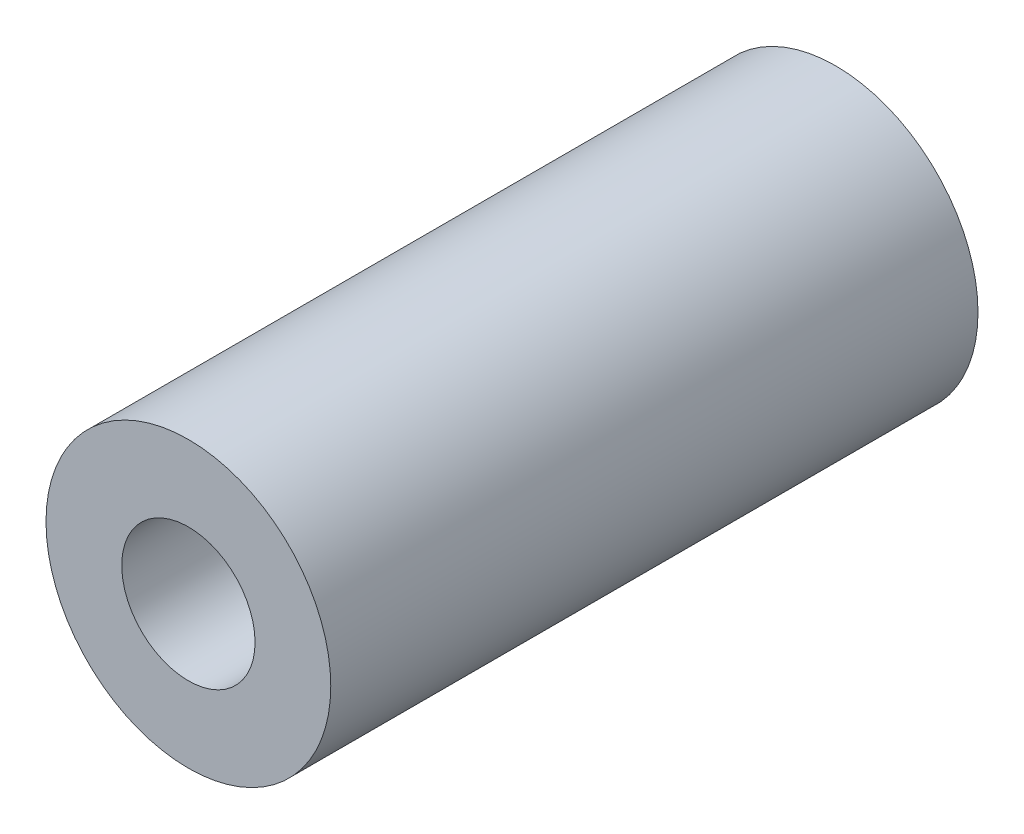
ISO-10303-21;
HEADER;
FILE_DESCRIPTION(('STEP AP214'),'2;1');
FILE_NAME('part.step','',(''),(''),'','','');
FILE_SCHEMA(('AUTOMOTIVE_DESIGN { 1 0 10303 214 1 1 1 1 }'));
ENDSEC;
DATA;
#1=APPLICATION_CONTEXT('core data for automotive mechanical design processes');
#2=APPLICATION_PROTOCOL_DEFINITION('international standard','automotive_design',2000,#1);
#3=PRODUCT_CONTEXT('',#1,'mechanical');
#4=PRODUCT('Part','Part','',(#3));
#5=PRODUCT_RELATED_PRODUCT_CATEGORY('part','',(#4));
#6=PRODUCT_DEFINITION_FORMATION('','',#4);
#7=PRODUCT_DEFINITION_CONTEXT('part definition',#1,'design');
#8=PRODUCT_DEFINITION('design','',#6,#7);
#9=PRODUCT_DEFINITION_SHAPE('','',#8);
#10=(LENGTH_UNIT() NAMED_UNIT(*) SI_UNIT(.MILLI.,.METRE.));
#11=(NAMED_UNIT(*) PLANE_ANGLE_UNIT() SI_UNIT($,.RADIAN.));
#12=(NAMED_UNIT(*) SI_UNIT($,.STERADIAN.) SOLID_ANGLE_UNIT());
#13=UNCERTAINTY_MEASURE_WITH_UNIT(LENGTH_MEASURE(1.E-05),#10,'distance_accuracy_value','');
#14=(GEOMETRIC_REPRESENTATION_CONTEXT(3) GLOBAL_UNCERTAINTY_ASSIGNED_CONTEXT((#13)) GLOBAL_UNIT_ASSIGNED_CONTEXT((#10,
#11,#12)) REPRESENTATION_CONTEXT('',''));
#15=CARTESIAN_POINT('',(0.,0.,0.));
#16=DIRECTION('',(0.,0.,1.));
#17=DIRECTION('',(1.,0.,0.));
#18=AXIS2_PLACEMENT_3D('',#15,#16,#17);
#19=CARTESIAN_POINT('',(10.,0.,2.));
#20=DIRECTION('',(0.,0.,1.));
#21=DIRECTION('',(1.,0.,0.));
#22=AXIS2_PLACEMENT_3D('',#19,#20,#21);
#23=CYLINDRICAL_SURFACE('',#22,5.5);
#24=CARTESIAN_POINT('',(10.,0.,13.));
#25=DIRECTION('',(0.,0.,1.));
#26=DIRECTION('',(1.,0.,0.));
#27=AXIS2_PLACEMENT_3D('',#24,#25,#26);
#28=CIRCLE('',#27,5.5);
#29=CARTESIAN_POINT('',(15.5,0.,13.));
#30=VERTEX_POINT('',#29);
#31=EDGE_CURVE('E116',#30,#30,#28,.T.);
#32=ORIENTED_EDGE('',*,*,#31,.F.);
#33=EDGE_LOOP('',(#32));
#34=FACE_BOUND('',#33,.T.);
#35=CARTESIAN_POINT('',(10.,0.,-12.));
#36=DIRECTION('',(0.,0.,-1.));
#37=DIRECTION('',(-1.,0.,0.));
#38=AXIS2_PLACEMENT_3D('',#35,#36,#37);
#39=CIRCLE('',#38,5.5);
#40=CARTESIAN_POINT('',(4.5,0.,-12.));
#41=VERTEX_POINT('',#40);
#42=EDGE_CURVE('E213',#41,#41,#39,.T.);
#43=ORIENTED_EDGE('',*,*,#42,.F.);
#44=EDGE_LOOP('',(#43));
#45=FACE_BOUND('',#44,.T.);
#46=ADVANCED_FACE('F57',(#34,#45),#23,.T.);
#47=CARTESIAN_POINT('',(10.,0.,13.));
#48=DIRECTION('',(0.,0.,1.));
#49=DIRECTION('',(1.,0.,0.));
#50=AXIS2_PLACEMENT_3D('',#47,#48,#49);
#51=PLANE('',#50);
#52=ORIENTED_EDGE('',*,*,#31,.T.);
#53=EDGE_LOOP('',(#52));
#54=FACE_BOUND('',#53,.T.);
#55=CARTESIAN_POINT('',(10.,0.,13.));
#56=DIRECTION('',(0.,0.,1.));
#57=DIRECTION('',(1.,0.,0.));
#58=AXIS2_PLACEMENT_3D('',#55,#56,#57);
#59=CIRCLE('',#58,2.575);
#60=CARTESIAN_POINT('',(12.575,0.,13.));
#61=VERTEX_POINT('',#60);
#62=EDGE_CURVE('E205',#61,#61,#59,.T.);
#63=ORIENTED_EDGE('',*,*,#62,.F.);
#64=EDGE_LOOP('',(#63));
#65=FACE_BOUND('',#64,.T.);
#66=ADVANCED_FACE('F151',(#54,#65),#51,.T.);
#67=CARTESIAN_POINT('',(10.,0.,3.2));
#68=DIRECTION('',(0.,0.,1.));
#69=DIRECTION('',(1.,0.,0.));
#70=AXIS2_PLACEMENT_3D('',#67,#68,#69);
#71=CYLINDRICAL_SURFACE('',#70,2.575);
#72=CARTESIAN_POINT('',(10.,0.,7.2));
#73=DIRECTION('',(0.,0.,1.));
#74=DIRECTION('',(1.,0.,0.));
#75=AXIS2_PLACEMENT_3D('',#72,#73,#74);
#76=CIRCLE('',#75,2.575);
#77=CARTESIAN_POINT('',(12.575,0.,7.2));
#78=VERTEX_POINT('',#77);
#79=EDGE_CURVE('E209',#78,#78,#76,.T.);
#80=ORIENTED_EDGE('',*,*,#79,.F.);
#81=EDGE_LOOP('',(#80));
#82=FACE_BOUND('',#81,.T.);
#83=ORIENTED_EDGE('',*,*,#62,.T.);
#84=EDGE_LOOP('',(#83));
#85=FACE_BOUND('',#84,.T.);
#86=ADVANCED_FACE('F234',(#82,#85),#71,.F.);
#87=CARTESIAN_POINT('',(10.,0.,7.2));
#88=DIRECTION('',(0.,0.,1.));
#89=DIRECTION('',(1.,0.,0.));
#90=AXIS2_PLACEMENT_3D('',#87,#88,#89);
#91=PLANE('',#90);
#92=ORIENTED_EDGE('',*,*,#79,.T.);
#93=EDGE_LOOP('',(#92));
#94=FACE_BOUND('',#93,.T.);
#95=ADVANCED_FACE('F229',(#94),#91,.T.);
#96=CARTESIAN_POINT('',(10.,0.,-12.));
#97=DIRECTION('',(0.,0.,1.));
#98=DIRECTION('',(1.,0.,0.));
#99=AXIS2_PLACEMENT_3D('',#96,#97,#98);
#100=CYLINDRICAL_SURFACE('',#99,4.5);
#101=CARTESIAN_POINT('',(10.,0.,-12.));
#102=DIRECTION('',(0.,0.,-1.));
#103=DIRECTION('',(-1.,0.,0.));
#104=AXIS2_PLACEMENT_3D('',#101,#102,#103);
#105=CIRCLE('',#104,4.5);
#106=CARTESIAN_POINT('',(5.5,0.,-12.));
#107=VERTEX_POINT('',#106);
#108=EDGE_CURVE('E217',#107,#107,#105,.T.);
#109=ORIENTED_EDGE('',*,*,#108,.T.);
#110=EDGE_LOOP('',(#109));
#111=FACE_BOUND('',#110,.T.);
#112=CARTESIAN_POINT('',(11.,4.38748219369606,0.999999999999999));
#113=CARTESIAN_POINT('',(11.0000002271548,4.3874805778013,1.02776343673585));
#114=CARTESIAN_POINT('',(10.9988430525421,4.38774605427742,1.05551321957021));
#115=CARTESIAN_POINT('',(10.994229328652,4.38879440795356,1.11080720358759));
#116=CARTESIAN_POINT('',(10.9907731063926,4.3895772115685,1.13835143344523));
#117=CARTESIAN_POINT('',(10.9770029556911,4.39267106819928,1.22027488575532));
#118=CARTESIAN_POINT('',(10.9632873499948,4.39572774349608,1.27409430984986));
#119=CARTESIAN_POINT('',(10.9272147151132,4.40347687632207,1.37859393292456));
#120=CARTESIAN_POINT('',(10.9048573167925,4.40816940372606,1.42927399769925));
#121=CARTESIAN_POINT('',(10.8521566293915,4.41865913159282,1.52618505036688));
#122=CARTESIAN_POINT('',(10.8218117381529,4.42445655361464,1.57241514312584));
#123=CARTESIAN_POINT('',(10.7534424909377,4.43661416599544,1.65988955298778));
#124=CARTESIAN_POINT('',(10.7153064065994,4.4429816856951,1.70104549615343));
#125=CARTESIAN_POINT('',(10.6326713535901,4.4554988564669,1.77643748444432));
#126=CARTESIAN_POINT('',(10.5881711857622,4.4616484662061,1.81067222249565));
#127=CARTESIAN_POINT('',(10.4934687158107,4.47311819819122,1.87160466427186));
#128=CARTESIAN_POINT('',(10.4432084719777,4.4784283286008,1.89821425841024));
#129=CARTESIAN_POINT('',(10.3388041930967,4.48753264692153,1.94256171890918));
#130=CARTESIAN_POINT('',(10.2846630293892,4.49132794221922,1.96030606840746));
#131=CARTESIAN_POINT('',(10.1918524490983,4.49606579682076,1.98218264843362));
#132=CARTESIAN_POINT('',(10.1537892434148,4.49753288084804,1.98885526694093));
#133=CARTESIAN_POINT('',(10.077157061699,4.49950350767662,1.9977659348373));
#134=CARTESIAN_POINT('',(10.0385885578001,4.50000789319572,2.00000786278274));
#135=CARTESIAN_POINT('',(10.,4.5,2.));
#136=B_SPLINE_CURVE_WITH_KNOTS('',3,(#112,#113,#114,#115,#116,#117,#118,#119,#120,#121,#122,
#123,#124,#125,#126,#127,#128,#129,#130,#131,#132,#133,#134,#135),.UNSPECIFIED.,.F.,.F.,(4,2,2,
2,2,2,2,2,2,2,2,4),(0.,0.083238019862018,0.166464202423338,0.332474072063291,0.498491033620594,
0.664541320830127,0.833165067614467,1.00182062941272,1.17235295167543,1.34276038073884,
1.45852112762865,1.57418049442813),.UNSPECIFIED.);
#137=CARTESIAN_POINT('',(11.,4.38748219369606,0.999999999999999));
#138=VERTEX_POINT('',#137);
#139=CARTESIAN_POINT('',(10.,4.5,2.));
#140=VERTEX_POINT('',#139);
#141=EDGE_CURVE('E68',#138,#140,#136,.T.);
#142=ORIENTED_EDGE('',*,*,#141,.T.);
#143=CARTESIAN_POINT('',(10.,4.5,2.));
#144=CARTESIAN_POINT('',(9.97222798279285,4.50000141835623,2.00000020406704));
#145=CARTESIAN_POINT('',(9.94446959113142,4.49974258775545,1.99884233571868));
#146=CARTESIAN_POINT('',(9.88915790277006,4.49871951361042,1.99422569850821));
#147=CARTESIAN_POINT('',(9.86160457903483,4.49795533792657,1.99076723858132));
#148=CARTESIAN_POINT('',(9.77965062015803,4.49493257916072,1.97698739496016));
#149=CARTESIAN_POINT('',(9.72580915099412,4.49194360792207,1.96326135975001));
#150=CARTESIAN_POINT('',(9.62126419304536,4.48434107914671,1.92715837743288));
#151=CARTESIAN_POINT('',(9.5705609499438,4.47972739460423,1.90478075400754));
#152=CARTESIAN_POINT('',(9.47361155064011,4.46937277287342,1.85203277940782));
#153=CARTESIAN_POINT('',(9.42736618765927,4.46363163561964,1.82166100935342));
#154=CARTESIAN_POINT('',(9.3399087420806,4.45154583986649,1.75326425101779));
#155=CARTESIAN_POINT('',(9.2987803858627,4.44519356763016,1.71513359430603));
#156=CARTESIAN_POINT('',(9.22344169050527,4.43265371720239,1.63252081553737));
#157=CARTESIAN_POINT('',(9.18923279444397,4.42646617359886,1.58803737187733));
#158=CARTESIAN_POINT('',(9.12832827664668,4.41487984737743,1.49335048303818));
#159=CARTESIAN_POINT('',(9.10172527982592,4.40949114440257,1.44308618249789));
#160=CARTESIAN_POINT('',(9.05739143314611,4.40022784762102,1.33867383869463));
#161=CARTESIAN_POINT('',(9.0396539041132,4.39635211443829,1.28452875445653));
#162=CARTESIAN_POINT('',(9.01779580237956,4.39150973400137,1.19173679596455));
#163=CARTESIAN_POINT('',(9.01113147078784,4.39000855246454,1.15369769761514));
#164=CARTESIAN_POINT('',(9.00223147373591,4.38799083437755,1.07711219186973));
#165=CARTESIAN_POINT('',(8.99999209210795,4.38747347160907,1.03856623755596));
#166=CARTESIAN_POINT('',(9.,4.38748219369606,0.999999999999999));
#167=B_SPLINE_CURVE_WITH_KNOTS('',3,(#143,#144,#145,#146,#147,#148,#149,#150,#151,#152,#153,
#154,#155,#156,#157,#158,#159,#160,#161,#162,#163,#164,#165,#166),.UNSPECIFIED.,.F.,.F.,(4,2,2,
2,2,2,2,2,2,2,2,4),(0.,0.0832638399317092,0.166516501024766,0.332586996091267,0.498670475969319,
0.664783453883492,0.833331638683261,1.0019149386503,1.17247140841256,1.34289918784782,
1.45858836675132,1.57418034604105),.UNSPECIFIED.);
#168=CARTESIAN_POINT('',(9.,4.38748219369606,0.999999999999999));
#169=VERTEX_POINT('',#168);
#170=EDGE_CURVE('E112',#140,#169,#167,.T.);
#171=ORIENTED_EDGE('',*,*,#170,.T.);
#172=DIRECTION('',(0.,0.,1.));
#173=VECTOR('',#172,1.);
#174=CARTESIAN_POINT('',(9.,4.38748219369606,-10.));
#175=LINE('',#174,#173);
#176=CARTESIAN_POINT('',(9.,4.38748219369606,-10.));
#177=VERTEX_POINT('',#176);
#178=EDGE_CURVE('E190',#177,#169,#175,.T.);
#179=ORIENTED_EDGE('',*,*,#178,.F.);
#180=CARTESIAN_POINT('',(10.,0.,-10.));
#181=DIRECTION('',(0.,0.,-1.));
#182=DIRECTION('',(-1.,0.,0.));
#183=AXIS2_PLACEMENT_3D('',#180,#181,#182);
#184=CIRCLE('',#183,4.5);
#185=CARTESIAN_POINT('',(9.,-4.38748219369606,-10.));
#186=VERTEX_POINT('',#185);
#187=EDGE_CURVE('E188',#186,#177,#184,.T.);
#188=ORIENTED_EDGE('',*,*,#187,.F.);
#189=DIRECTION('',(0.,0.,1.));
#190=VECTOR('',#189,1.);
#191=CARTESIAN_POINT('',(9.,-4.38748219369606,-10.));
#192=LINE('',#191,#190);
#193=CARTESIAN_POINT('',(9.,-4.38748219369606,0.999999999999999));
#194=VERTEX_POINT('',#193);
#195=EDGE_CURVE('E122',#186,#194,#192,.T.);
#196=ORIENTED_EDGE('',*,*,#195,.T.);
#197=CARTESIAN_POINT('',(9.,-4.38748219369606,0.999999999999999));
#198=CARTESIAN_POINT('',(8.99999977284519,-4.3874805778013,1.02776343673585));
#199=CARTESIAN_POINT('',(9.0011569474579,-4.38774605427743,1.05551321957021));
#200=CARTESIAN_POINT('',(9.00577067134805,-4.38879440795356,1.11080720358759));
#201=CARTESIAN_POINT('',(9.00922689360742,-4.3895772115685,1.13835143344523));
#202=CARTESIAN_POINT('',(9.02299704430893,-4.39267106819928,1.22027488575532));
#203=CARTESIAN_POINT('',(9.03671265000516,-4.39572774349608,1.27409430984986));
#204=CARTESIAN_POINT('',(9.0727852848868,-4.40347687632207,1.37859393292456));
#205=CARTESIAN_POINT('',(9.09514268320753,-4.40816940372606,1.42927399769925));
#206=CARTESIAN_POINT('',(9.14784337060851,-4.41865913159283,1.52618505036688));
#207=CARTESIAN_POINT('',(9.17818826184709,-4.42445655361464,1.57241514312584));
#208=CARTESIAN_POINT('',(9.24655750906227,-4.43661416599544,1.65988955298778));
#209=CARTESIAN_POINT('',(9.28469359340062,-4.4429816856951,1.70104549615343));
#210=CARTESIAN_POINT('',(9.36732864640992,-4.4554988564669,1.77643748444432));
#211=CARTESIAN_POINT('',(9.41182881423781,-4.4616484662061,1.81067222249565));
#212=CARTESIAN_POINT('',(9.50653128418931,-4.47311819819122,1.87160466427186));
#213=CARTESIAN_POINT('',(9.55679152802235,-4.4784283286008,1.89821425841024));
#214=CARTESIAN_POINT('',(9.66119580690326,-4.48753264692153,1.94256171890918));
#215=CARTESIAN_POINT('',(9.71533697061081,-4.49132794221922,1.96030606840746));
#216=CARTESIAN_POINT('',(9.80814755090169,-4.49606579682076,1.98218264843362));
#217=CARTESIAN_POINT('',(9.84621075658522,-4.49753288084804,1.98885526694093));
#218=CARTESIAN_POINT('',(9.92284293830104,-4.49950350767662,1.9977659348373));
#219=CARTESIAN_POINT('',(9.96141144219989,-4.50000789319572,2.00000786278274));
#220=CARTESIAN_POINT('',(10.,-4.5,2.));
#221=B_SPLINE_CURVE_WITH_KNOTS('',3,(#197,#198,#199,#200,#201,#202,#203,#204,#205,#206,#207,
#208,#209,#210,#211,#212,#213,#214,#215,#216,#217,#218,#219,#220),.UNSPECIFIED.,.F.,.F.,(4,2,2,
2,2,2,2,2,2,2,2,4),(0.,0.083238019862018,0.166464202423338,0.332474072063291,0.498491033620593,
0.664541320830127,0.833165067614467,1.00182062941272,1.17235295167542,1.34276038073884,
1.45852112762865,1.57418049442813),.UNSPECIFIED.);
#222=CARTESIAN_POINT('',(10.,-4.5,2.));
#223=VERTEX_POINT('',#222);
#224=EDGE_CURVE('E109',#194,#223,#221,.T.);
#225=ORIENTED_EDGE('',*,*,#224,.T.);
#226=CARTESIAN_POINT('',(10.,-4.5,2.));
#227=CARTESIAN_POINT('',(10.0277720172072,-4.50000141835623,2.00000020406704));
#228=CARTESIAN_POINT('',(10.0555304088686,-4.49974258775545,1.99884233571868));
#229=CARTESIAN_POINT('',(10.1108420972299,-4.49871951361042,1.99422569850821));
#230=CARTESIAN_POINT('',(10.1383954209652,-4.49795533792657,1.99076723858132));
#231=CARTESIAN_POINT('',(10.220349379842,-4.49493257916072,1.97698739496016));
#232=CARTESIAN_POINT('',(10.2741908490059,-4.49194360792207,1.96326135975001));
#233=CARTESIAN_POINT('',(10.3787358069546,-4.48434107914671,1.92715837743288));
#234=CARTESIAN_POINT('',(10.4294390500562,-4.47972739460423,1.90478075400754));
#235=CARTESIAN_POINT('',(10.5263884493599,-4.46937277287342,1.85203277940782));
#236=CARTESIAN_POINT('',(10.5726338123407,-4.46363163561964,1.82166100935342));
#237=CARTESIAN_POINT('',(10.6600912579194,-4.45154583986649,1.75326425101779));
#238=CARTESIAN_POINT('',(10.7012196141373,-4.44519356763016,1.71513359430603));
#239=CARTESIAN_POINT('',(10.7765583094947,-4.43265371720239,1.63252081553737));
#240=CARTESIAN_POINT('',(10.810767205556,-4.42646617359886,1.58803737187733));
#241=CARTESIAN_POINT('',(10.8716717233533,-4.41487984737743,1.49335048303818));
#242=CARTESIAN_POINT('',(10.8982747201741,-4.40949114440257,1.44308618249789));
#243=CARTESIAN_POINT('',(10.9426085668539,-4.40022784762102,1.33867383869463));
#244=CARTESIAN_POINT('',(10.9603460958868,-4.39635211443829,1.28452875445653));
#245=CARTESIAN_POINT('',(10.9822041976204,-4.39150973400137,1.19173679596455));
#246=CARTESIAN_POINT('',(10.9888685292122,-4.39000855246454,1.15369769761514));
#247=CARTESIAN_POINT('',(10.9977685262641,-4.38799083437755,1.07711219186973));
#248=CARTESIAN_POINT('',(11.0000079078921,-4.38747347160907,1.03856623755596));
#249=CARTESIAN_POINT('',(11.,-4.38748219369606,0.999999999999999));
#250=B_SPLINE_CURVE_WITH_KNOTS('',3,(#226,#227,#228,#229,#230,#231,#232,#233,#234,#235,#236,
#237,#238,#239,#240,#241,#242,#243,#244,#245,#246,#247,#248,#249),.UNSPECIFIED.,.F.,.F.,(4,2,2,
2,2,2,2,2,2,2,2,4),(0.,0.0832638399317074,0.166516501024766,0.332586996091267,0.498670475969317,
0.664783453883492,0.833331638683262,1.0019149386503,1.17247140841256,1.34289918784782,
1.45858836675132,1.57418034604105),.UNSPECIFIED.);
#251=CARTESIAN_POINT('',(11.,-4.38748219369606,0.999999999999999));
#252=VERTEX_POINT('',#251);
#253=EDGE_CURVE('E11',#223,#252,#250,.T.);
#254=ORIENTED_EDGE('',*,*,#253,.T.);
#255=DIRECTION('',(0.,0.,1.));
#256=VECTOR('',#255,1.);
#257=CARTESIAN_POINT('',(11.,-4.38748219369606,-10.));
#258=LINE('',#257,#256);
#259=CARTESIAN_POINT('',(11.,-4.38748219369606,-10.));
#260=VERTEX_POINT('',#259);
#261=EDGE_CURVE('E75',#260,#252,#258,.T.);
#262=ORIENTED_EDGE('',*,*,#261,.F.);
#263=CARTESIAN_POINT('',(10.,0.,-10.));
#264=DIRECTION('',(0.,0.,-1.));
#265=DIRECTION('',(-1.,0.,0.));
#266=AXIS2_PLACEMENT_3D('',#263,#264,#265);
#267=CIRCLE('',#266,4.5);
#268=CARTESIAN_POINT('',(11.,4.38748219369606,-10.));
#269=VERTEX_POINT('',#268);
#270=EDGE_CURVE('E177',#269,#260,#267,.T.);
#271=ORIENTED_EDGE('',*,*,#270,.F.);
#272=DIRECTION('',(0.,0.,1.));
#273=VECTOR('',#272,1.);
#274=CARTESIAN_POINT('',(11.,4.38748219369606,-10.));
#275=LINE('',#274,#273);
#276=EDGE_CURVE('E175',#269,#138,#275,.T.);
#277=ORIENTED_EDGE('',*,*,#276,.T.);
#278=EDGE_LOOP('',(#142,#171,#179,#188,#196,#225,#254,#262,#271,#277));
#279=FACE_BOUND('',#278,.T.);
#280=ADVANCED_FACE('F119',(#111,#279),#100,.F.);
#281=CARTESIAN_POINT('',(10.,0.,-12.));
#282=DIRECTION('',(0.,0.,-1.));
#283=DIRECTION('',(-1.,0.,0.));
#284=AXIS2_PLACEMENT_3D('',#281,#282,#283);
#285=PLANE('',#284);
#286=ORIENTED_EDGE('',*,*,#42,.T.);
#287=EDGE_LOOP('',(#286));
#288=FACE_BOUND('',#287,.T.);
#289=ORIENTED_EDGE('',*,*,#108,.F.);
#290=EDGE_LOOP('',(#289));
#291=FACE_BOUND('',#290,.T.);
#292=ADVANCED_FACE('F156',(#288,#291),#285,.T.);
#293=CARTESIAN_POINT('',(10.,0.,-10.));
#294=DIRECTION('',(0.,0.,-1.));
#295=DIRECTION('',(-1.,0.,0.));
#296=AXIS2_PLACEMENT_3D('',#293,#294,#295);
#297=PLANE('',#296);
#298=ORIENTED_EDGE('',*,*,#270,.T.);
#299=DIRECTION('',(0.,1.,0.));
#300=VECTOR('',#299,1.);
#301=CARTESIAN_POINT('',(11.,4.38748219369606,-10.));
#302=LINE('',#301,#300);
#303=EDGE_CURVE('E179',#260,#269,#302,.T.);
#304=ORIENTED_EDGE('',*,*,#303,.T.);
#305=EDGE_LOOP('',(#298,#304));
#306=FACE_BOUND('',#305,.T.);
#307=ADVANCED_FACE('F153',(#306),#297,.T.);
#308=CARTESIAN_POINT('',(10.,0.,-10.));
#309=DIRECTION('',(0.,0.,-1.));
#310=DIRECTION('',(-1.,0.,0.));
#311=AXIS2_PLACEMENT_3D('',#308,#309,#310);
#312=PLANE('',#311);
#313=ORIENTED_EDGE('',*,*,#187,.T.);
#314=DIRECTION('',(0.,-1.,0.));
#315=VECTOR('',#314,1.);
#316=CARTESIAN_POINT('',(9.,4.38748219369606,-10.));
#317=LINE('',#316,#315);
#318=EDGE_CURVE('E194',#177,#186,#317,.T.);
#319=ORIENTED_EDGE('',*,*,#318,.T.);
#320=EDGE_LOOP('',(#313,#319));
#321=FACE_BOUND('',#320,.T.);
#322=ADVANCED_FACE('F147',(#321),#312,.T.);
#323=CARTESIAN_POINT('',(10.,4.38748219369606,0.999999999999999));
#324=DIRECTION('',(0.,-1.,0.));
#325=DIRECTION('',(0.,0.,-1.));
#326=AXIS2_PLACEMENT_3D('',#323,#324,#325);
#327=CYLINDRICAL_SURFACE('',#326,1.);
#328=ORIENTED_EDGE('',*,*,#170,.F.);
#329=DIRECTION('',(0.,1.,0.));
#330=VECTOR('',#329,1.);
#331=CARTESIAN_POINT('',(10.,0.,2.));
#332=LINE('',#331,#330);
#333=EDGE_CURVE('E62',#140,#223,#332,.F.);
#334=ORIENTED_EDGE('',*,*,#333,.T.);
#335=ORIENTED_EDGE('',*,*,#224,.F.);
#336=DIRECTION('',(0.,-1.,0.));
#337=VECTOR('',#336,1.);
#338=CARTESIAN_POINT('',(9.,4.38748219369606,0.999999999999999));
#339=LINE('',#338,#337);
#340=EDGE_CURVE('E128',#169,#194,#339,.T.);
#341=ORIENTED_EDGE('',*,*,#340,.F.);
#342=EDGE_LOOP('',(#328,#334,#335,#341));
#343=FACE_BOUND('',#342,.T.);
#344=ADVANCED_FACE('F106',(#343),#327,.F.);
#345=CARTESIAN_POINT('',(10.,4.38748219369606,0.999999999999999));
#346=DIRECTION('',(0.,1.,0.));
#347=DIRECTION('',(0.,0.,1.));
#348=AXIS2_PLACEMENT_3D('',#345,#346,#347);
#349=CYLINDRICAL_SURFACE('',#348,1.);
#350=ORIENTED_EDGE('',*,*,#333,.F.);
#351=ORIENTED_EDGE('',*,*,#141,.F.);
#352=DIRECTION('',(0.,1.,0.));
#353=VECTOR('',#352,1.);
#354=CARTESIAN_POINT('',(11.,4.38748219369606,0.999999999999999));
#355=LINE('',#354,#353);
#356=EDGE_CURVE('E79',#252,#138,#355,.T.);
#357=ORIENTED_EDGE('',*,*,#356,.F.);
#358=ORIENTED_EDGE('',*,*,#253,.F.);
#359=EDGE_LOOP('',(#350,#351,#357,#358));
#360=FACE_BOUND('',#359,.T.);
#361=ADVANCED_FACE('F59',(#360),#349,.F.);
#362=CARTESIAN_POINT('',(9.,4.38748219369606,-10.));
#363=DIRECTION('',(-1.,0.,0.));
#364=DIRECTION('',(0.,0.,1.));
#365=AXIS2_PLACEMENT_3D('',#362,#363,#364);
#366=PLANE('',#365);
#367=ORIENTED_EDGE('',*,*,#178,.T.);
#368=ORIENTED_EDGE('',*,*,#340,.T.);
#369=ORIENTED_EDGE('',*,*,#195,.F.);
#370=ORIENTED_EDGE('',*,*,#318,.F.);
#371=EDGE_LOOP('',(#367,#368,#369,#370));
#372=FACE_BOUND('',#371,.T.);
#373=ADVANCED_FACE('F160',(#372),#366,.F.);
#374=CARTESIAN_POINT('',(11.,4.38748219369606,-10.));
#375=DIRECTION('',(1.,0.,0.));
#376=DIRECTION('',(0.,0.,-1.));
#377=AXIS2_PLACEMENT_3D('',#374,#375,#376);
#378=PLANE('',#377);
#379=ORIENTED_EDGE('',*,*,#261,.T.);
#380=ORIENTED_EDGE('',*,*,#356,.T.);
#381=ORIENTED_EDGE('',*,*,#276,.F.);
#382=ORIENTED_EDGE('',*,*,#303,.F.);
#383=EDGE_LOOP('',(#379,#380,#381,#382));
#384=FACE_BOUND('',#383,.T.);
#385=ADVANCED_FACE('F158',(#384),#378,.F.);
#386=CLOSED_SHELL('',(#46,#66,#86,#95,#280,#292,#307,#322,#344,#361,#373,#385));
#387=MANIFOLD_SOLID_BREP('B2',#386);
#388=ADVANCED_BREP_SHAPE_REPRESENTATION('',(#18,#387),#14);
#389=SHAPE_DEFINITION_REPRESENTATION(#9,#388);
ENDSEC;
END-ISO-10303-21;
